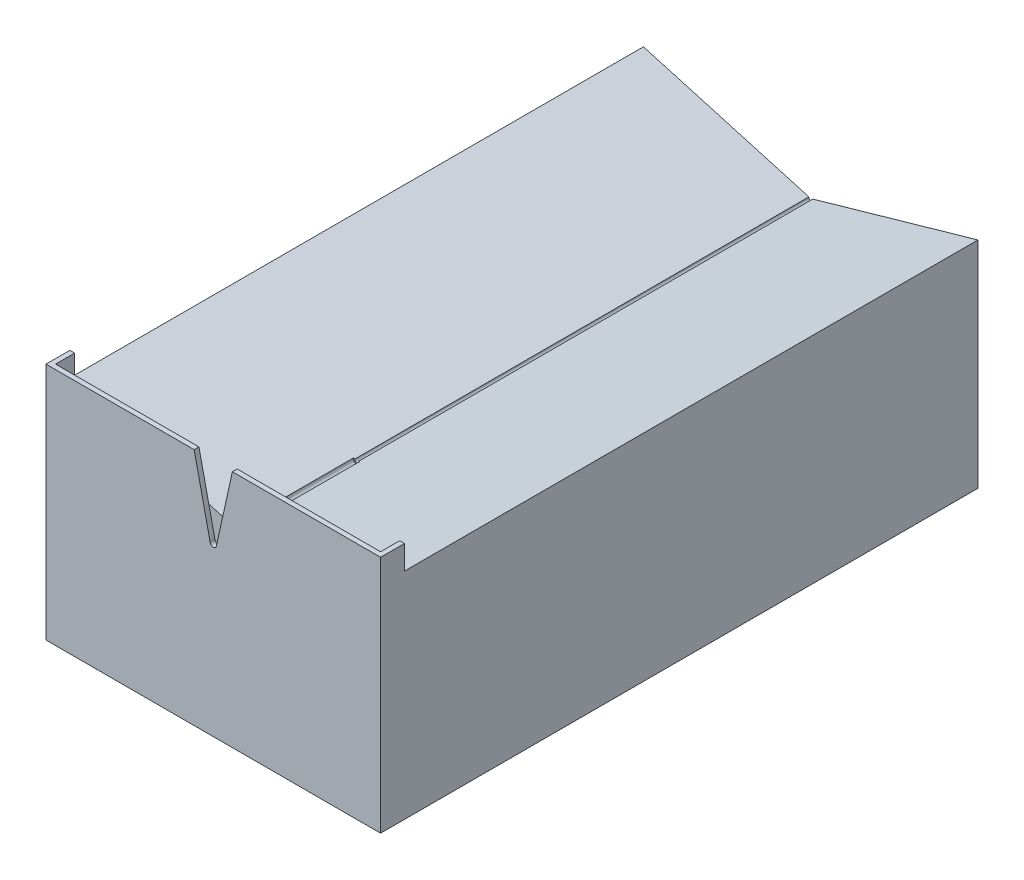
ISO-10303-21;
HEADER;
FILE_DESCRIPTION(('STEP AP214'),'2;1');
FILE_NAME('part.step','',(''),(''),'','','');
FILE_SCHEMA(('AUTOMOTIVE_DESIGN { 1 0 10303 214 1 1 1 1 }'));
ENDSEC;
DATA;
#1=APPLICATION_CONTEXT('core data for automotive mechanical design processes');
#2=APPLICATION_PROTOCOL_DEFINITION('international standard','automotive_design',2000,#1);
#3=PRODUCT_CONTEXT('',#1,'mechanical');
#4=PRODUCT('Part','Part','',(#3));
#5=PRODUCT_RELATED_PRODUCT_CATEGORY('part','',(#4));
#6=PRODUCT_DEFINITION_FORMATION('','',#4);
#7=PRODUCT_DEFINITION_CONTEXT('part definition',#1,'design');
#8=PRODUCT_DEFINITION('design','',#6,#7);
#9=PRODUCT_DEFINITION_SHAPE('','',#8);
#10=(LENGTH_UNIT() NAMED_UNIT(*) SI_UNIT(.MILLI.,.METRE.));
#11=(NAMED_UNIT(*) PLANE_ANGLE_UNIT() SI_UNIT($,.RADIAN.));
#12=(NAMED_UNIT(*) SI_UNIT($,.STERADIAN.) SOLID_ANGLE_UNIT());
#13=UNCERTAINTY_MEASURE_WITH_UNIT(LENGTH_MEASURE(1.E-05),#10,'distance_accuracy_value','');
#14=(GEOMETRIC_REPRESENTATION_CONTEXT(3) GLOBAL_UNCERTAINTY_ASSIGNED_CONTEXT((#13)) GLOBAL_UNIT_ASSIGNED_CONTEXT((#10,
#11,#12)) REPRESENTATION_CONTEXT('',''));
#15=CARTESIAN_POINT('',(0.,0.,0.));
#16=DIRECTION('',(0.,0.,1.));
#17=DIRECTION('',(1.,0.,0.));
#18=AXIS2_PLACEMENT_3D('',#15,#16,#17);
#19=CARTESIAN_POINT('',(-35.,27.5,125.));
#20=DIRECTION('',(0.,-1.,0.));
#21=DIRECTION('',(0.,0.,-1.));
#22=AXIS2_PLACEMENT_3D('',#19,#20,#21);
#23=PLANE('',#22);
#24=DIRECTION('',(-1.,0.,0.));
#25=VECTOR('',#24,1.);
#26=CARTESIAN_POINT('',(-35.,27.5,125.));
#27=LINE('',#26,#25);
#28=CARTESIAN_POINT('',(-4.,27.5,125.));
#29=VERTEX_POINT('',#28);
#30=CARTESIAN_POINT('',(-35.,27.5,125.));
#31=VERTEX_POINT('',#30);
#32=EDGE_CURVE('E245',#29,#31,#27,.T.);
#33=ORIENTED_EDGE('',*,*,#32,.F.);
#34=DIRECTION('',(0.,0.,1.));
#35=VECTOR('',#34,1.);
#36=CARTESIAN_POINT('',(-4.,27.5,121.));
#37=LINE('',#36,#35);
#38=CARTESIAN_POINT('',(-4.,27.5,124.));
#39=VERTEX_POINT('',#38);
#40=EDGE_CURVE('E335',#39,#29,#37,.T.);
#41=ORIENTED_EDGE('',*,*,#40,.F.);
#42=DIRECTION('',(1.,0.,0.));
#43=VECTOR('',#42,1.);
#44=CARTESIAN_POINT('',(34.,27.5,124.));
#45=LINE('',#44,#43);
#46=CARTESIAN_POINT('',(-34.,27.5,124.));
#47=VERTEX_POINT('',#46);
#48=EDGE_CURVE('E216',#47,#39,#45,.T.);
#49=ORIENTED_EDGE('',*,*,#48,.F.);
#50=DIRECTION('',(0.,0.,1.));
#51=VECTOR('',#50,1.);
#52=CARTESIAN_POINT('',(-34.,27.5,124.));
#53=LINE('',#52,#51);
#54=CARTESIAN_POINT('',(-34.,27.5,120.));
#55=VERTEX_POINT('',#54);
#56=EDGE_CURVE('E199',#55,#47,#53,.T.);
#57=ORIENTED_EDGE('',*,*,#56,.F.);
#58=DIRECTION('',(-1.,0.,0.));
#59=VECTOR('',#58,1.);
#60=CARTESIAN_POINT('',(-35.,27.5,120.));
#61=LINE('',#60,#59);
#62=CARTESIAN_POINT('',(-35.,27.5,120.));
#63=VERTEX_POINT('',#62);
#64=EDGE_CURVE('E252',#55,#63,#61,.T.);
#65=ORIENTED_EDGE('',*,*,#64,.T.);
#66=DIRECTION('',(0.,0.,-1.));
#67=VECTOR('',#66,1.);
#68=CARTESIAN_POINT('',(-35.,27.5,125.));
#69=LINE('',#68,#67);
#70=EDGE_CURVE('E247',#31,#63,#69,.T.);
#71=ORIENTED_EDGE('',*,*,#70,.F.);
#72=EDGE_LOOP('',(#33,#41,#49,#57,#65,#71));
#73=FACE_BOUND('',#72,.T.);
#74=ADVANCED_FACE('F32',(#73),#23,.F.);
#75=CARTESIAN_POINT('',(0.0240380986910074,12.4931319718026,120.));
#76=DIRECTION('',(0.,0.,-1.));
#77=DIRECTION('',(-1.,0.,0.));
#78=AXIS2_PLACEMENT_3D('',#75,#76,#77);
#79=CYLINDRICAL_SURFACE('',#78,0.425);
#80=CARTESIAN_POINT('',(0.0240380986910074,12.4931319718026,95.));
#81=DIRECTION('',(0.,0.,1.));
#82=DIRECTION('',(1.,0.,0.));
#83=AXIS2_PLACEMENT_3D('',#80,#81,#82);
#84=CIRCLE('',#83,0.425);
#85=CARTESIAN_POINT('',(0.428860009969026,12.6225314314197,95.));
#86=VERTEX_POINT('',#85);
#87=CARTESIAN_POINT('',(-0.384609579056342,12.6098884511589,95.));
#88=VERTEX_POINT('',#87);
#89=EDGE_CURVE('E167',#86,#88,#84,.F.);
#90=ORIENTED_EDGE('',*,*,#89,.F.);
#91=DIRECTION('',(0.,0.,-1.));
#92=VECTOR('',#91,1.);
#93=CARTESIAN_POINT('',(0.428860009969026,12.6225314314197,120.));
#94=LINE('',#93,#92);
#95=CARTESIAN_POINT('',(0.428860009969026,12.6225314314197,0.));
#96=VERTEX_POINT('',#95);
#97=EDGE_CURVE('E283',#86,#96,#94,.T.);
#98=ORIENTED_EDGE('',*,*,#97,.T.);
#99=CARTESIAN_POINT('',(0.0240380986910074,12.4931319718026,0.));
#100=DIRECTION('',(0.,0.,-1.));
#101=DIRECTION('',(1.,0.,0.));
#102=AXIS2_PLACEMENT_3D('',#99,#100,#101);
#103=CIRCLE('',#102,0.425);
#104=CARTESIAN_POINT('',(-0.384609579056342,12.6098884511589,0.));
#105=VERTEX_POINT('',#104);
#106=EDGE_CURVE('E279',#96,#105,#103,.T.);
#107=ORIENTED_EDGE('',*,*,#106,.T.);
#108=DIRECTION('',(0.,0.,-1.));
#109=VECTOR('',#108,1.);
#110=CARTESIAN_POINT('',(-0.384609579056342,12.6098884511589,120.));
#111=LINE('',#110,#109);
#112=EDGE_CURVE('E267',#88,#105,#111,.T.);
#113=ORIENTED_EDGE('',*,*,#112,.F.);
#114=EDGE_LOOP('',(#90,#98,#107,#113));
#115=FACE_BOUND('',#114,.T.);
#116=ADVANCED_FACE('F309',(#115),#79,.F.);
#117=CARTESIAN_POINT('',(0.,0.,120.));
#118=DIRECTION('',(0.,0.,-1.));
#119=DIRECTION('',(-1.,0.,0.));
#120=AXIS2_PLACEMENT_3D('',#117,#118,#119);
#121=PLANE('',#120);
#122=DIRECTION('',(0.,1.,0.));
#123=VECTOR('',#122,1.);
#124=CARTESIAN_POINT('',(-34.,-20.5,120.));
#125=LINE('',#124,#123);
#126=CARTESIAN_POINT('',(-34.,22.2142857142857,120.));
#127=VERTEX_POINT('',#126);
#128=EDGE_CURVE('E224',#127,#55,#125,.T.);
#129=ORIENTED_EDGE('',*,*,#128,.F.);
#130=DIRECTION('',(-0.961523947640823,0.274721127897378,0.));
#131=VECTOR('',#130,1.);
#132=CARTESIAN_POINT('',(-35.,22.5,120.));
#133=LINE('',#132,#131);
#134=CARTESIAN_POINT('',(-35.,22.5,120.));
#135=VERTEX_POINT('',#134);
#136=EDGE_CURVE('E264',#127,#135,#133,.T.);
#137=ORIENTED_EDGE('',*,*,#136,.T.);
#138=DIRECTION('',(0.,-1.,0.));
#139=VECTOR('',#138,1.);
#140=CARTESIAN_POINT('',(-35.,-22.5,120.));
#141=LINE('',#140,#139);
#142=EDGE_CURVE('E235',#63,#135,#141,.T.);
#143=ORIENTED_EDGE('',*,*,#142,.F.);
#144=ORIENTED_EDGE('',*,*,#64,.F.);
#145=EDGE_LOOP('',(#129,#137,#143,#144));
#146=FACE_BOUND('',#145,.T.);
#147=ADVANCED_FACE('F326',(#146),#121,.T.);
#148=CARTESIAN_POINT('',(-35.,22.5,120.));
#149=DIRECTION('',(-0.274721127897378,-0.961523947640823,0.));
#150=DIRECTION('',(0.961523947640823,-0.274721127897378,0.));
#151=AXIS2_PLACEMENT_3D('',#148,#149,#150);
#152=PLANE('',#151);
#153=CARTESIAN_POINT('',(-0.64902866465757,12.6854367613307,120.));
#154=VERTEX_POINT('',#153);
#155=EDGE_CURVE('E261',#154,#127,#133,.T.);
#156=ORIENTED_EDGE('',*,*,#155,.F.);
#157=DIRECTION('',(0.,0.,1.));
#158=VECTOR('',#157,1.);
#159=CARTESIAN_POINT('',(-0.64902866465757,12.6854367613307,95.));
#160=LINE('',#159,#158);
#161=CARTESIAN_POINT('',(-0.64902866465757,12.6854367613307,95.));
#162=VERTEX_POINT('',#161);
#163=EDGE_CURVE('E192',#154,#162,#160,.F.);
#164=ORIENTED_EDGE('',*,*,#163,.T.);
#165=DIRECTION('',(-0.961523947640823,0.274721127897378,0.));
#166=VECTOR('',#165,1.);
#167=CARTESIAN_POINT('',(-35.,22.5,95.));
#168=LINE('',#167,#166);
#169=EDGE_CURVE('E197',#88,#162,#168,.T.);
#170=ORIENTED_EDGE('',*,*,#169,.F.);
#171=ORIENTED_EDGE('',*,*,#112,.T.);
#172=DIRECTION('',(-0.961523947640823,0.274721127897378,0.));
#173=VECTOR('',#172,1.);
#174=CARTESIAN_POINT('',(-35.,22.5,0.));
#175=LINE('',#174,#173);
#176=CARTESIAN_POINT('',(-35.,22.5,0.));
#177=VERTEX_POINT('',#176);
#178=EDGE_CURVE('E260',#105,#177,#175,.T.);
#179=ORIENTED_EDGE('',*,*,#178,.T.);
#180=DIRECTION('',(0.,0.,-1.));
#181=VECTOR('',#180,1.);
#182=CARTESIAN_POINT('',(-35.,22.5,120.));
#183=LINE('',#182,#181);
#184=EDGE_CURVE('E294',#135,#177,#183,.T.);
#185=ORIENTED_EDGE('',*,*,#184,.F.);
#186=ORIENTED_EDGE('',*,*,#136,.F.);
#187=EDGE_LOOP('',(#156,#164,#170,#171,#179,#185,#186));
#188=FACE_BOUND('',#187,.T.);
#189=ADVANCED_FACE('F34',(#188),#152,.F.);
#190=CARTESIAN_POINT('',(-35.,-22.5,120.));
#191=DIRECTION('',(1.,0.,0.));
#192=DIRECTION('',(0.,0.,-1.));
#193=AXIS2_PLACEMENT_3D('',#190,#191,#192);
#194=PLANE('',#193);
#195=DIRECTION('',(0.,-1.,0.));
#196=VECTOR('',#195,1.);
#197=CARTESIAN_POINT('',(-35.,-22.5,0.));
#198=LINE('',#197,#196);
#199=CARTESIAN_POINT('',(-35.,-22.5,0.));
#200=VERTEX_POINT('',#199);
#201=EDGE_CURVE('E270',#177,#200,#198,.T.);
#202=ORIENTED_EDGE('',*,*,#201,.T.);
#203=DIRECTION('',(0.,0.,-1.));
#204=VECTOR('',#203,1.);
#205=CARTESIAN_POINT('',(-35.,-22.5,120.));
#206=LINE('',#205,#204);
#207=CARTESIAN_POINT('',(-35.,-22.5,125.));
#208=VERTEX_POINT('',#207);
#209=EDGE_CURVE('E291',#208,#200,#206,.T.);
#210=ORIENTED_EDGE('',*,*,#209,.F.);
#211=DIRECTION('',(0.,-1.,0.));
#212=VECTOR('',#211,1.);
#213=CARTESIAN_POINT('',(-35.,-22.5,125.));
#214=LINE('',#213,#212);
#215=EDGE_CURVE('E236',#31,#208,#214,.T.);
#216=ORIENTED_EDGE('',*,*,#215,.F.);
#217=ORIENTED_EDGE('',*,*,#70,.T.);
#218=ORIENTED_EDGE('',*,*,#142,.T.);
#219=ORIENTED_EDGE('',*,*,#184,.T.);
#220=EDGE_LOOP('',(#202,#210,#216,#217,#218,#219));
#221=FACE_BOUND('',#220,.T.);
#222=ADVANCED_FACE('F320',(#221),#194,.F.);
#223=CARTESIAN_POINT('',(35.,-22.5,120.));
#224=DIRECTION('',(0.,1.,0.));
#225=DIRECTION('',(-1.,0.,0.));
#226=AXIS2_PLACEMENT_3D('',#223,#224,#225);
#227=PLANE('',#226);
#228=DIRECTION('',(1.,0.,0.));
#229=VECTOR('',#228,1.);
#230=CARTESIAN_POINT('',(35.,-22.5,0.));
#231=LINE('',#230,#229);
#232=CARTESIAN_POINT('',(35.,-22.5,0.));
#233=VERTEX_POINT('',#232);
#234=EDGE_CURVE('E272',#200,#233,#231,.T.);
#235=ORIENTED_EDGE('',*,*,#234,.T.);
#236=DIRECTION('',(0.,0.,-1.));
#237=VECTOR('',#236,1.);
#238=CARTESIAN_POINT('',(35.,-22.5,120.));
#239=LINE('',#238,#237);
#240=CARTESIAN_POINT('',(35.,-22.5,125.));
#241=VERTEX_POINT('',#240);
#242=EDGE_CURVE('E288',#241,#233,#239,.T.);
#243=ORIENTED_EDGE('',*,*,#242,.F.);
#244=DIRECTION('',(1.,0.,0.));
#245=VECTOR('',#244,1.);
#246=CARTESIAN_POINT('',(-35.,-22.5,125.));
#247=LINE('',#246,#245);
#248=EDGE_CURVE('E239',#208,#241,#247,.T.);
#249=ORIENTED_EDGE('',*,*,#248,.F.);
#250=ORIENTED_EDGE('',*,*,#209,.T.);
#251=EDGE_LOOP('',(#235,#243,#249,#250));
#252=FACE_BOUND('',#251,.T.);
#253=ADVANCED_FACE('F359',(#252),#227,.F.);
#254=CARTESIAN_POINT('',(35.,-22.5,120.));
#255=DIRECTION('',(-1.,0.,0.));
#256=DIRECTION('',(0.,0.,1.));
#257=AXIS2_PLACEMENT_3D('',#254,#255,#256);
#258=PLANE('',#257);
#259=DIRECTION('',(0.,1.,0.));
#260=VECTOR('',#259,1.);
#261=CARTESIAN_POINT('',(35.,-22.5,0.));
#262=LINE('',#261,#260);
#263=CARTESIAN_POINT('',(35.,22.5,0.));
#264=VERTEX_POINT('',#263);
#265=EDGE_CURVE('E274',#233,#264,#262,.T.);
#266=ORIENTED_EDGE('',*,*,#265,.T.);
#267=DIRECTION('',(0.,0.,-1.));
#268=VECTOR('',#267,1.);
#269=CARTESIAN_POINT('',(35.,22.5,120.));
#270=LINE('',#269,#268);
#271=CARTESIAN_POINT('',(35.,22.5,120.));
#272=VERTEX_POINT('',#271);
#273=EDGE_CURVE('E285',#272,#264,#270,.T.);
#274=ORIENTED_EDGE('',*,*,#273,.F.);
#275=DIRECTION('',(0.,1.,0.));
#276=VECTOR('',#275,1.);
#277=CARTESIAN_POINT('',(35.,-22.5,120.));
#278=LINE('',#277,#276);
#279=CARTESIAN_POINT('',(35.,27.5,120.));
#280=VERTEX_POINT('',#279);
#281=EDGE_CURVE('E250',#272,#280,#278,.T.);
#282=ORIENTED_EDGE('',*,*,#281,.T.);
#283=DIRECTION('',(0.,0.,-1.));
#284=VECTOR('',#283,1.);
#285=CARTESIAN_POINT('',(35.,27.5,125.));
#286=LINE('',#285,#284);
#287=CARTESIAN_POINT('',(35.,27.5,125.));
#288=VERTEX_POINT('',#287);
#289=EDGE_CURVE('E257',#288,#280,#286,.T.);
#290=ORIENTED_EDGE('',*,*,#289,.F.);
#291=DIRECTION('',(0.,1.,0.));
#292=VECTOR('',#291,1.);
#293=CARTESIAN_POINT('',(35.,-22.5,125.));
#294=LINE('',#293,#292);
#295=EDGE_CURVE('E243',#241,#288,#294,.T.);
#296=ORIENTED_EDGE('',*,*,#295,.F.);
#297=ORIENTED_EDGE('',*,*,#242,.T.);
#298=EDGE_LOOP('',(#266,#274,#282,#290,#296,#297));
#299=FACE_BOUND('',#298,.T.);
#300=ADVANCED_FACE('F354',(#299),#258,.F.);
#301=CARTESIAN_POINT('',(0.428860009969026,12.6225314314197,120.));
#302=DIRECTION('',(0.274721127897378,-0.961523947640823,0.));
#303=DIRECTION('',(0.961523947640823,0.274721127897378,0.));
#304=AXIS2_PLACEMENT_3D('',#301,#302,#303);
#305=PLANE('',#304);
#306=DIRECTION('',(-0.961523947640823,-0.274721127897378,0.));
#307=VECTOR('',#306,1.);
#308=CARTESIAN_POINT('',(0.428860009969026,12.6225314314197,95.));
#309=LINE('',#308,#307);
#310=CARTESIAN_POINT('',(0.649028664657543,12.6854367613307,95.));
#311=VERTEX_POINT('',#310);
#312=EDGE_CURVE('E195',#311,#86,#309,.T.);
#313=ORIENTED_EDGE('',*,*,#312,.F.);
#314=DIRECTION('',(0.,0.,1.));
#315=VECTOR('',#314,1.);
#316=CARTESIAN_POINT('',(0.649028664657543,12.6854367613307,95.));
#317=LINE('',#316,#315);
#318=CARTESIAN_POINT('',(0.649028664657543,12.6854367613307,120.));
#319=VERTEX_POINT('',#318);
#320=EDGE_CURVE('E189',#311,#319,#317,.T.);
#321=ORIENTED_EDGE('',*,*,#320,.T.);
#322=DIRECTION('',(0.961523947640823,0.274721127897378,0.));
#323=VECTOR('',#322,1.);
#324=CARTESIAN_POINT('',(0.428860009969026,12.6225314314197,120.));
#325=LINE('',#324,#323);
#326=CARTESIAN_POINT('',(34.,22.2142857142857,120.));
#327=VERTEX_POINT('',#326);
#328=EDGE_CURVE('E223',#319,#327,#325,.T.);
#329=ORIENTED_EDGE('',*,*,#328,.T.);
#330=DIRECTION('',(-0.961523947640823,-0.274721127897378,0.));
#331=VECTOR('',#330,1.);
#332=CARTESIAN_POINT('',(0.428860009969026,12.6225314314197,120.));
#333=LINE('',#332,#331);
#334=EDGE_CURVE('E263',#272,#327,#333,.T.);
#335=ORIENTED_EDGE('',*,*,#334,.F.);
#336=ORIENTED_EDGE('',*,*,#273,.T.);
#337=DIRECTION('',(-0.961523947640823,-0.274721127897378,0.));
#338=VECTOR('',#337,1.);
#339=CARTESIAN_POINT('',(0.428860009969026,12.6225314314197,0.));
#340=LINE('',#339,#338);
#341=EDGE_CURVE('E276',#264,#96,#340,.T.);
#342=ORIENTED_EDGE('',*,*,#341,.T.);
#343=ORIENTED_EDGE('',*,*,#97,.F.);
#344=EDGE_LOOP('',(#313,#321,#329,#335,#336,#342,#343));
#345=FACE_BOUND('',#344,.T.);
#346=ADVANCED_FACE('F349',(#345),#305,.F.);
#347=CARTESIAN_POINT('',(0.0240380986910074,12.4931319718026,0.));
#348=DIRECTION('',(0.,0.,1.));
#349=DIRECTION('',(1.,0.,0.));
#350=AXIS2_PLACEMENT_3D('',#347,#348,#349);
#351=PLANE('',#350);
#352=ORIENTED_EDGE('',*,*,#178,.F.);
#353=ORIENTED_EDGE('',*,*,#106,.F.);
#354=ORIENTED_EDGE('',*,*,#341,.F.);
#355=ORIENTED_EDGE('',*,*,#265,.F.);
#356=ORIENTED_EDGE('',*,*,#234,.F.);
#357=ORIENTED_EDGE('',*,*,#201,.F.);
#358=EDGE_LOOP('',(#352,#353,#354,#355,#356,#357));
#359=FACE_BOUND('',#358,.T.);
#360=ADVANCED_FACE('F314',(#359),#351,.F.);
#361=DIRECTION('',(0.,1.,0.));
#362=VECTOR('',#361,1.);
#363=CARTESIAN_POINT('',(34.,-20.5,120.));
#364=LINE('',#363,#362);
#365=CARTESIAN_POINT('',(34.,27.5,120.));
#366=VERTEX_POINT('',#365);
#367=EDGE_CURVE('E228',#327,#366,#364,.T.);
#368=ORIENTED_EDGE('',*,*,#367,.T.);
#369=EDGE_CURVE('E240',#280,#366,#61,.T.);
#370=ORIENTED_EDGE('',*,*,#369,.F.);
#371=ORIENTED_EDGE('',*,*,#281,.F.);
#372=ORIENTED_EDGE('',*,*,#334,.T.);
#373=EDGE_LOOP('',(#368,#370,#371,#372));
#374=FACE_BOUND('',#373,.T.);
#375=ADVANCED_FACE('F374',(#374),#121,.T.);
#376=CARTESIAN_POINT('',(4.,27.5,124.));
#377=VERTEX_POINT('',#376);
#378=CARTESIAN_POINT('',(34.,27.5,124.));
#379=VERTEX_POINT('',#378);
#380=EDGE_CURVE('E215',#377,#379,#45,.T.);
#381=ORIENTED_EDGE('',*,*,#380,.F.);
#382=DIRECTION('',(0.,0.,1.));
#383=VECTOR('',#382,1.);
#384=CARTESIAN_POINT('',(4.,27.5,121.));
#385=LINE('',#384,#383);
#386=CARTESIAN_POINT('',(4.,27.5,125.));
#387=VERTEX_POINT('',#386);
#388=EDGE_CURVE('E360',#377,#387,#385,.T.);
#389=ORIENTED_EDGE('',*,*,#388,.T.);
#390=EDGE_CURVE('E174',#288,#387,#27,.T.);
#391=ORIENTED_EDGE('',*,*,#390,.F.);
#392=ORIENTED_EDGE('',*,*,#289,.T.);
#393=ORIENTED_EDGE('',*,*,#369,.T.);
#394=DIRECTION('',(0.,0.,-1.));
#395=VECTOR('',#394,1.);
#396=CARTESIAN_POINT('',(34.,27.5,124.));
#397=LINE('',#396,#395);
#398=EDGE_CURVE('E204',#379,#366,#397,.T.);
#399=ORIENTED_EDGE('',*,*,#398,.F.);
#400=EDGE_LOOP('',(#381,#389,#391,#392,#393,#399));
#401=FACE_BOUND('',#400,.T.);
#402=ADVANCED_FACE('F368',(#401),#23,.F.);
#403=CARTESIAN_POINT('',(0.,0.,125.));
#404=DIRECTION('',(0.,0.,-1.));
#405=DIRECTION('',(-1.,0.,0.));
#406=AXIS2_PLACEMENT_3D('',#403,#404,#405);
#407=PLANE('',#406);
#408=CARTESIAN_POINT('',(0.,12.5,125.));
#409=DIRECTION('',(0.,0.,1.));
#410=DIRECTION('',(1.,0.,0.));
#411=AXIS2_PLACEMENT_3D('',#408,#409,#410);
#412=CIRCLE('',#411,0.675);
#413=CARTESIAN_POINT('',(-0.675000000000014,12.5,125.));
#414=VERTEX_POINT('',#413);
#415=CARTESIAN_POINT('',(0.674999999999986,12.5,125.));
#416=VERTEX_POINT('',#415);
#417=EDGE_CURVE('E172',#414,#416,#412,.T.);
#418=ORIENTED_EDGE('',*,*,#417,.F.);
#419=DIRECTION('',(0.216413561761721,-0.976301782383708,0.));
#420=VECTOR('',#419,1.);
#421=CARTESIAN_POINT('',(-0.675000000000014,12.5,125.));
#422=LINE('',#421,#420);
#423=EDGE_CURVE('E55',#29,#414,#422,.T.);
#424=ORIENTED_EDGE('',*,*,#423,.F.);
#425=ORIENTED_EDGE('',*,*,#32,.T.);
#426=ORIENTED_EDGE('',*,*,#215,.T.);
#427=ORIENTED_EDGE('',*,*,#248,.T.);
#428=ORIENTED_EDGE('',*,*,#295,.T.);
#429=ORIENTED_EDGE('',*,*,#390,.T.);
#430=DIRECTION('',(0.216413561761723,0.976301782383708,0.));
#431=VECTOR('',#430,1.);
#432=CARTESIAN_POINT('',(0.674999999999986,12.5,125.));
#433=LINE('',#432,#431);
#434=EDGE_CURVE('E161',#416,#387,#433,.T.);
#435=ORIENTED_EDGE('',*,*,#434,.F.);
#436=EDGE_LOOP('',(#418,#424,#425,#426,#427,#428,#429,#435));
#437=FACE_BOUND('',#436,.T.);
#438=ADVANCED_FACE('F171',(#437),#407,.F.);
#439=CARTESIAN_POINT('',(-34.,-20.5,120.));
#440=DIRECTION('',(0.,0.,-1.));
#441=DIRECTION('',(-1.,0.,0.));
#442=AXIS2_PLACEMENT_3D('',#439,#440,#441);
#443=PLANE('',#442);
#444=ORIENTED_EDGE('',*,*,#328,.F.);
#445=CARTESIAN_POINT('',(0.,12.5,120.));
#446=DIRECTION('',(0.,0.,-1.));
#447=DIRECTION('',(-1.,0.,0.));
#448=AXIS2_PLACEMENT_3D('',#445,#446,#447);
#449=CIRCLE('',#448,0.675);
#450=EDGE_CURVE('E186',#319,#154,#449,.T.);
#451=ORIENTED_EDGE('',*,*,#450,.T.);
#452=ORIENTED_EDGE('',*,*,#155,.T.);
#453=CARTESIAN_POINT('',(-34.,-20.5,120.));
#454=VERTEX_POINT('',#453);
#455=EDGE_CURVE('E220',#454,#127,#125,.T.);
#456=ORIENTED_EDGE('',*,*,#455,.F.);
#457=DIRECTION('',(-1.,0.,0.));
#458=VECTOR('',#457,1.);
#459=CARTESIAN_POINT('',(-34.,-20.5,120.));
#460=LINE('',#459,#458);
#461=CARTESIAN_POINT('',(34.,-20.5,120.));
#462=VERTEX_POINT('',#461);
#463=EDGE_CURVE('E210',#462,#454,#460,.T.);
#464=ORIENTED_EDGE('',*,*,#463,.F.);
#465=EDGE_CURVE('E225',#462,#327,#364,.T.);
#466=ORIENTED_EDGE('',*,*,#465,.T.);
#467=EDGE_LOOP('',(#444,#451,#452,#456,#464,#466));
#468=FACE_BOUND('',#467,.T.);
#469=ADVANCED_FACE('F345',(#468),#443,.F.);
#470=CARTESIAN_POINT('',(-34.,-20.5,124.));
#471=DIRECTION('',(-1.,0.,0.));
#472=DIRECTION('',(0.,0.,1.));
#473=AXIS2_PLACEMENT_3D('',#470,#471,#472);
#474=PLANE('',#473);
#475=ORIENTED_EDGE('',*,*,#56,.T.);
#476=DIRECTION('',(0.,1.,0.));
#477=VECTOR('',#476,1.);
#478=CARTESIAN_POINT('',(-34.,-20.5,124.));
#479=LINE('',#478,#477);
#480=CARTESIAN_POINT('',(-34.,-20.5,124.));
#481=VERTEX_POINT('',#480);
#482=EDGE_CURVE('E213',#481,#47,#479,.T.);
#483=ORIENTED_EDGE('',*,*,#482,.F.);
#484=DIRECTION('',(0.,0.,1.));
#485=VECTOR('',#484,1.);
#486=CARTESIAN_POINT('',(-34.,-20.5,124.));
#487=LINE('',#486,#485);
#488=EDGE_CURVE('E200',#454,#481,#487,.T.);
#489=ORIENTED_EDGE('',*,*,#488,.F.);
#490=ORIENTED_EDGE('',*,*,#455,.T.);
#491=ORIENTED_EDGE('',*,*,#128,.T.);
#492=EDGE_LOOP('',(#475,#483,#489,#490,#491));
#493=FACE_BOUND('',#492,.T.);
#494=ADVANCED_FACE('F329',(#493),#474,.F.);
#495=CARTESIAN_POINT('',(34.,-20.5,124.));
#496=DIRECTION('',(1.,0.,0.));
#497=DIRECTION('',(0.,0.,-1.));
#498=AXIS2_PLACEMENT_3D('',#495,#496,#497);
#499=PLANE('',#498);
#500=ORIENTED_EDGE('',*,*,#398,.T.);
#501=ORIENTED_EDGE('',*,*,#367,.F.);
#502=ORIENTED_EDGE('',*,*,#465,.F.);
#503=DIRECTION('',(0.,0.,-1.));
#504=VECTOR('',#503,1.);
#505=CARTESIAN_POINT('',(34.,-20.5,124.));
#506=LINE('',#505,#504);
#507=CARTESIAN_POINT('',(34.,-20.5,124.));
#508=VERTEX_POINT('',#507);
#509=EDGE_CURVE('E207',#508,#462,#506,.T.);
#510=ORIENTED_EDGE('',*,*,#509,.F.);
#511=DIRECTION('',(0.,1.,0.));
#512=VECTOR('',#511,1.);
#513=CARTESIAN_POINT('',(34.,-20.5,124.));
#514=LINE('',#513,#512);
#515=EDGE_CURVE('E229',#508,#379,#514,.T.);
#516=ORIENTED_EDGE('',*,*,#515,.T.);
#517=EDGE_LOOP('',(#500,#501,#502,#510,#516));
#518=FACE_BOUND('',#517,.T.);
#519=ADVANCED_FACE('F372',(#518),#499,.F.);
#520=CARTESIAN_POINT('',(34.,-20.5,124.));
#521=DIRECTION('',(0.,0.,1.));
#522=DIRECTION('',(1.,0.,0.));
#523=AXIS2_PLACEMENT_3D('',#520,#521,#522);
#524=PLANE('',#523);
#525=ORIENTED_EDGE('',*,*,#48,.T.);
#526=DIRECTION('',(0.216413561761721,-0.976301782383708,0.));
#527=VECTOR('',#526,1.);
#528=CARTESIAN_POINT('',(7.92140094098577,-26.2807561247481,124.));
#529=LINE('',#528,#527);
#530=CARTESIAN_POINT('',(-0.675000000000014,12.5,124.));
#531=VERTEX_POINT('',#530);
#532=EDGE_CURVE('E178',#39,#531,#529,.T.);
#533=ORIENTED_EDGE('',*,*,#532,.T.);
#534=CARTESIAN_POINT('',(0.,12.5,124.));
#535=DIRECTION('',(0.,0.,1.));
#536=DIRECTION('',(1.,0.,0.));
#537=AXIS2_PLACEMENT_3D('',#534,#535,#536);
#538=CIRCLE('',#537,0.675);
#539=CARTESIAN_POINT('',(0.674999999999986,12.5,124.));
#540=VERTEX_POINT('',#539);
#541=EDGE_CURVE('E181',#531,#540,#538,.T.);
#542=ORIENTED_EDGE('',*,*,#541,.T.);
#543=DIRECTION('',(0.216413561761723,0.976301782383708,0.));
#544=VECTOR('',#543,1.);
#545=CARTESIAN_POINT('',(-4.73663252040702,-11.9133797913098,124.));
#546=LINE('',#545,#544);
#547=EDGE_CURVE('E47',#540,#377,#546,.T.);
#548=ORIENTED_EDGE('',*,*,#547,.T.);
#549=ORIENTED_EDGE('',*,*,#380,.T.);
#550=ORIENTED_EDGE('',*,*,#515,.F.);
#551=DIRECTION('',(1.,0.,0.));
#552=VECTOR('',#551,1.);
#553=CARTESIAN_POINT('',(34.,-20.5,124.));
#554=LINE('',#553,#552);
#555=EDGE_CURVE('E203',#481,#508,#554,.T.);
#556=ORIENTED_EDGE('',*,*,#555,.F.);
#557=ORIENTED_EDGE('',*,*,#482,.T.);
#558=EDGE_LOOP('',(#525,#533,#542,#548,#549,#550,#556,#557));
#559=FACE_BOUND('',#558,.T.);
#560=ADVANCED_FACE('F337',(#559),#524,.F.);
#561=CARTESIAN_POINT('',(0.,-20.5,0.));
#562=DIRECTION('',(0.,-1.,0.));
#563=DIRECTION('',(0.,0.,-1.));
#564=AXIS2_PLACEMENT_3D('',#561,#562,#563);
#565=PLANE('',#564);
#566=ORIENTED_EDGE('',*,*,#488,.T.);
#567=ORIENTED_EDGE('',*,*,#555,.T.);
#568=ORIENTED_EDGE('',*,*,#509,.T.);
#569=ORIENTED_EDGE('',*,*,#463,.T.);
#570=EDGE_LOOP('',(#566,#567,#568,#569));
#571=FACE_BOUND('',#570,.T.);
#572=ADVANCED_FACE('F341',(#571),#565,.F.);
#573=CARTESIAN_POINT('',(0.,12.5,95.));
#574=DIRECTION('',(0.,0.,1.));
#575=DIRECTION('',(1.,0.,0.));
#576=AXIS2_PLACEMENT_3D('',#573,#574,#575);
#577=CYLINDRICAL_SURFACE('',#576,0.675);
#578=ORIENTED_EDGE('',*,*,#541,.F.);
#579=DIRECTION('',(0.,0.,1.));
#580=VECTOR('',#579,1.);
#581=CARTESIAN_POINT('',(-0.675000000000014,12.5,95.));
#582=LINE('',#581,#580);
#583=EDGE_CURVE('E11',#531,#414,#582,.T.);
#584=ORIENTED_EDGE('',*,*,#583,.T.);
#585=ORIENTED_EDGE('',*,*,#417,.T.);
#586=DIRECTION('',(0.,0.,1.));
#587=VECTOR('',#586,1.);
#588=CARTESIAN_POINT('',(0.674999999999986,12.5,95.));
#589=LINE('',#588,#587);
#590=EDGE_CURVE('E40',#416,#540,#589,.F.);
#591=ORIENTED_EDGE('',*,*,#590,.T.);
#592=EDGE_LOOP('',(#578,#584,#585,#591));
#593=FACE_BOUND('',#592,.T.);
#594=ADVANCED_FACE('F176',(#593),#577,.F.);
#595=CARTESIAN_POINT('',(0.,12.5,95.));
#596=DIRECTION('',(0.,0.,1.));
#597=DIRECTION('',(1.,0.,0.));
#598=AXIS2_PLACEMENT_3D('',#595,#596,#597);
#599=PLANE('',#598);
#600=ORIENTED_EDGE('',*,*,#169,.T.);
#601=CARTESIAN_POINT('',(0.,12.5,95.));
#602=DIRECTION('',(0.,0.,1.));
#603=DIRECTION('',(1.,0.,0.));
#604=AXIS2_PLACEMENT_3D('',#601,#602,#603);
#605=CIRCLE('',#604,0.675);
#606=EDGE_CURVE('E177',#162,#311,#605,.T.);
#607=ORIENTED_EDGE('',*,*,#606,.T.);
#608=ORIENTED_EDGE('',*,*,#312,.T.);
#609=ORIENTED_EDGE('',*,*,#89,.T.);
#610=EDGE_LOOP('',(#600,#607,#608,#609));
#611=FACE_BOUND('',#610,.T.);
#612=ADVANCED_FACE('F301',(#611),#599,.T.);
#613=ORIENTED_EDGE('',*,*,#450,.F.);
#614=ORIENTED_EDGE('',*,*,#320,.F.);
#615=ORIENTED_EDGE('',*,*,#606,.F.);
#616=ORIENTED_EDGE('',*,*,#163,.F.);
#617=EDGE_LOOP('',(#613,#614,#615,#616));
#618=FACE_BOUND('',#617,.T.);
#619=ADVANCED_FACE('F347',(#618),#577,.F.);
#620=CARTESIAN_POINT('',(0.674999999999986,12.5,121.));
#621=DIRECTION('',(0.976301782383708,-0.216413561761723,0.));
#622=DIRECTION('',(0.216413561761723,0.976301782383708,0.));
#623=AXIS2_PLACEMENT_3D('',#620,#621,#622);
#624=PLANE('',#623);
#625=ORIENTED_EDGE('',*,*,#590,.F.);
#626=ORIENTED_EDGE('',*,*,#434,.T.);
#627=ORIENTED_EDGE('',*,*,#388,.F.);
#628=ORIENTED_EDGE('',*,*,#547,.F.);
#629=EDGE_LOOP('',(#625,#626,#627,#628));
#630=FACE_BOUND('',#629,.T.);
#631=ADVANCED_FACE('F160',(#630),#624,.F.);
#632=CARTESIAN_POINT('',(-0.675000000000014,12.5,121.));
#633=DIRECTION('',(-0.976301782383708,-0.216413561761721,0.));
#634=DIRECTION('',(0.216413561761721,-0.976301782383708,0.));
#635=AXIS2_PLACEMENT_3D('',#632,#633,#634);
#636=PLANE('',#635);
#637=ORIENTED_EDGE('',*,*,#40,.T.);
#638=ORIENTED_EDGE('',*,*,#423,.T.);
#639=ORIENTED_EDGE('',*,*,#583,.F.);
#640=ORIENTED_EDGE('',*,*,#532,.F.);
#641=EDGE_LOOP('',(#637,#638,#639,#640));
#642=FACE_BOUND('',#641,.T.);
#643=ADVANCED_FACE('F504',(#642),#636,.F.);
#644=CLOSED_SHELL('',(#74,#116,#147,#189,#222,#253,#300,#346,#360,#375,#402,#438,#469,#494,#519,
#560,#572,#594,#612,#619,#631,#643));
#645=MANIFOLD_SOLID_BREP('B2',#644);
#646=ADVANCED_BREP_SHAPE_REPRESENTATION('',(#18,#645),#14);
#647=SHAPE_DEFINITION_REPRESENTATION(#9,#646);
ENDSEC;
END-ISO-10303-21;
